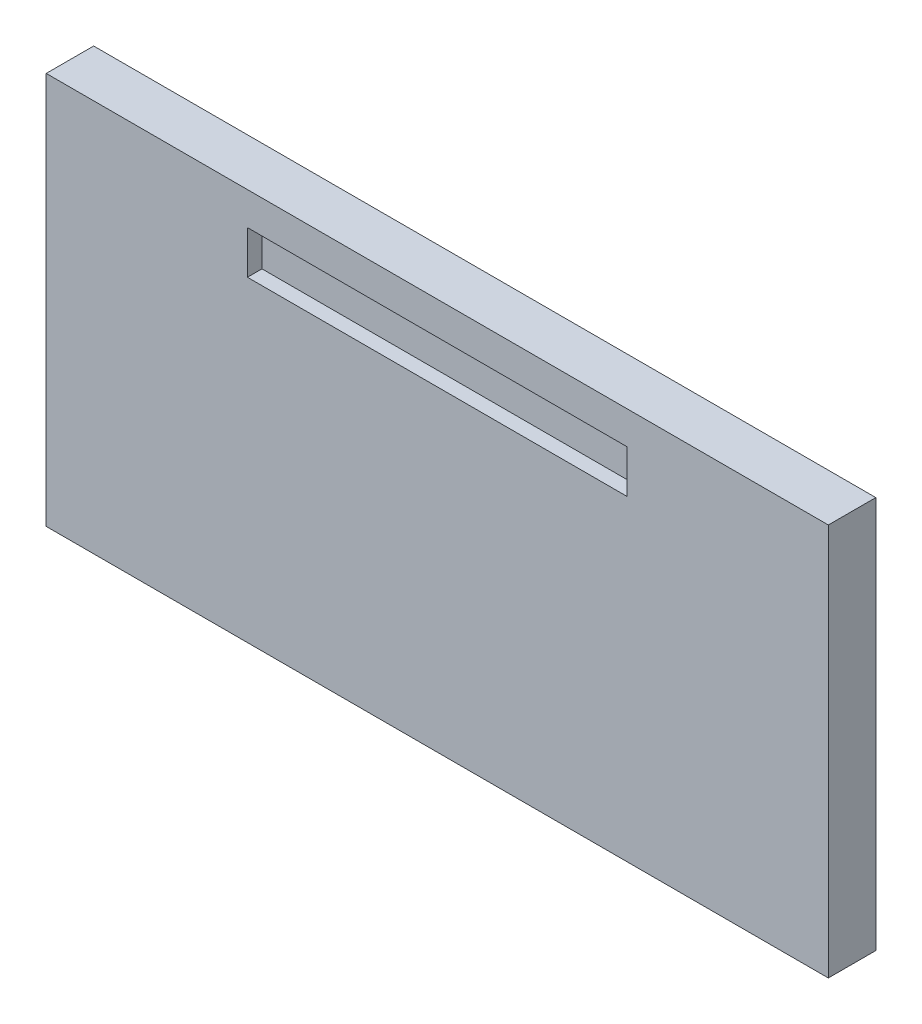
ISO-10303-21;
HEADER;
FILE_DESCRIPTION(('STEP AP214'),'2;1');
FILE_NAME('part.step','',(''),(''),'','','');
FILE_SCHEMA(('AUTOMOTIVE_DESIGN { 1 0 10303 214 1 1 1 1 }'));
ENDSEC;
DATA;
#1=APPLICATION_CONTEXT('core data for automotive mechanical design processes');
#2=APPLICATION_PROTOCOL_DEFINITION('international standard','automotive_design',2000,#1);
#3=PRODUCT_CONTEXT('',#1,'mechanical');
#4=PRODUCT('Part','Part','',(#3));
#5=PRODUCT_RELATED_PRODUCT_CATEGORY('part','',(#4));
#6=PRODUCT_DEFINITION_FORMATION('','',#4);
#7=PRODUCT_DEFINITION_CONTEXT('part definition',#1,'design');
#8=PRODUCT_DEFINITION('design','',#6,#7);
#9=PRODUCT_DEFINITION_SHAPE('','',#8);
#10=(LENGTH_UNIT() NAMED_UNIT(*) SI_UNIT(.MILLI.,.METRE.));
#11=(NAMED_UNIT(*) PLANE_ANGLE_UNIT() SI_UNIT($,.RADIAN.));
#12=(NAMED_UNIT(*) SI_UNIT($,.STERADIAN.) SOLID_ANGLE_UNIT());
#13=UNCERTAINTY_MEASURE_WITH_UNIT(LENGTH_MEASURE(1.E-05),#10,'distance_accuracy_value','');
#14=(GEOMETRIC_REPRESENTATION_CONTEXT(3) GLOBAL_UNCERTAINTY_ASSIGNED_CONTEXT((#13)) GLOBAL_UNIT_ASSIGNED_CONTEXT((#10,
#11,#12)) REPRESENTATION_CONTEXT('',''));
#15=CARTESIAN_POINT('',(0.,0.,0.));
#16=DIRECTION('',(0.,0.,1.));
#17=DIRECTION('',(1.,0.,0.));
#18=AXIS2_PLACEMENT_3D('',#15,#16,#17);
#19=CARTESIAN_POINT('',(0.,0.,38.5));
#20=DIRECTION('',(0.,0.,-1.));
#21=DIRECTION('',(-1.,0.,0.));
#22=AXIS2_PLACEMENT_3D('',#19,#20,#21);
#23=PLANE('',#22);
#24=DIRECTION('',(0.,-1.,0.));
#25=VECTOR('',#24,1.);
#26=CARTESIAN_POINT('',(0.,0.,38.5));
#27=LINE('',#26,#25);
#28=CARTESIAN_POINT('',(0.,310.,38.5));
#29=VERTEX_POINT('',#28);
#30=CARTESIAN_POINT('',(0.,0.,38.5));
#31=VERTEX_POINT('',#30);
#32=EDGE_CURVE('E145',#29,#31,#27,.T.);
#33=ORIENTED_EDGE('',*,*,#32,.T.);
#34=DIRECTION('',(1.,0.,0.));
#35=VECTOR('',#34,1.);
#36=CARTESIAN_POINT('',(0.,0.,38.5));
#37=LINE('',#36,#35);
#38=CARTESIAN_POINT('',(618.,0.,38.5));
#39=VERTEX_POINT('',#38);
#40=EDGE_CURVE('E92',#31,#39,#37,.T.);
#41=ORIENTED_EDGE('',*,*,#40,.T.);
#42=DIRECTION('',(0.,1.,0.));
#43=VECTOR('',#42,1.);
#44=CARTESIAN_POINT('',(618.,0.,38.5));
#45=LINE('',#44,#43);
#46=CARTESIAN_POINT('',(618.,310.,38.5));
#47=VERTEX_POINT('',#46);
#48=EDGE_CURVE('E148',#39,#47,#45,.T.);
#49=ORIENTED_EDGE('',*,*,#48,.T.);
#50=DIRECTION('',(-1.,0.,0.));
#51=VECTOR('',#50,1.);
#52=CARTESIAN_POINT('',(0.,310.,38.5));
#53=LINE('',#52,#51);
#54=EDGE_CURVE('E63',#47,#29,#53,.T.);
#55=ORIENTED_EDGE('',*,*,#54,.T.);
#56=EDGE_LOOP('',(#33,#41,#49,#55));
#57=FACE_BOUND('',#56,.T.);
#58=DIRECTION('',(0.,-1.,0.));
#59=VECTOR('',#58,1.);
#60=CARTESIAN_POINT('',(159.,0.,38.5));
#61=LINE('',#60,#59);
#62=CARTESIAN_POINT('',(159.,284.,38.5));
#63=VERTEX_POINT('',#62);
#64=CARTESIAN_POINT('',(159.,250.,38.5));
#65=VERTEX_POINT('',#64);
#66=EDGE_CURVE('E11',#63,#65,#61,.T.);
#67=ORIENTED_EDGE('',*,*,#66,.F.);
#68=DIRECTION('',(-1.,0.,0.));
#69=VECTOR('',#68,1.);
#70=CARTESIAN_POINT('',(0.,284.,38.5));
#71=LINE('',#70,#69);
#72=CARTESIAN_POINT('',(459.,284.,38.5));
#73=VERTEX_POINT('',#72);
#74=EDGE_CURVE('E167',#73,#63,#71,.T.);
#75=ORIENTED_EDGE('',*,*,#74,.F.);
#76=DIRECTION('',(0.,1.,0.));
#77=VECTOR('',#76,1.);
#78=CARTESIAN_POINT('',(459.,0.,38.5));
#79=LINE('',#78,#77);
#80=CARTESIAN_POINT('',(459.,250.,38.5));
#81=VERTEX_POINT('',#80);
#82=EDGE_CURVE('E169',#81,#73,#79,.T.);
#83=ORIENTED_EDGE('',*,*,#82,.F.);
#84=DIRECTION('',(1.,0.,0.));
#85=VECTOR('',#84,1.);
#86=CARTESIAN_POINT('',(0.,250.,38.5));
#87=LINE('',#86,#85);
#88=EDGE_CURVE('E47',#65,#81,#87,.T.);
#89=ORIENTED_EDGE('',*,*,#88,.F.);
#90=EDGE_LOOP('',(#67,#75,#83,#89));
#91=FACE_BOUND('',#90,.T.);
#92=ADVANCED_FACE('F39',(#57,#91),#23,.F.);
#93=CARTESIAN_POINT('',(0.,0.,38.5));
#94=DIRECTION('',(1.,0.,0.));
#95=DIRECTION('',(0.,0.,-1.));
#96=AXIS2_PLACEMENT_3D('',#93,#94,#95);
#97=PLANE('',#96);
#98=DIRECTION('',(0.,-1.,0.));
#99=VECTOR('',#98,1.);
#100=CARTESIAN_POINT('',(0.,0.,1.));
#101=LINE('',#100,#99);
#102=CARTESIAN_POINT('',(0.,310.,1.));
#103=VERTEX_POINT('',#102);
#104=CARTESIAN_POINT('',(0.,0.,1.));
#105=VERTEX_POINT('',#104);
#106=EDGE_CURVE('E122',#103,#105,#101,.T.);
#107=ORIENTED_EDGE('',*,*,#106,.T.);
#108=DIRECTION('',(0.,0.,-1.));
#109=VECTOR('',#108,1.);
#110=CARTESIAN_POINT('',(0.,0.,38.5));
#111=LINE('',#110,#109);
#112=EDGE_CURVE('E165',#31,#105,#111,.T.);
#113=ORIENTED_EDGE('',*,*,#112,.F.);
#114=ORIENTED_EDGE('',*,*,#32,.F.);
#115=DIRECTION('',(0.,0.,-1.));
#116=VECTOR('',#115,1.);
#117=CARTESIAN_POINT('',(0.,310.,38.5));
#118=LINE('',#117,#116);
#119=EDGE_CURVE('E151',#29,#103,#118,.T.);
#120=ORIENTED_EDGE('',*,*,#119,.T.);
#121=EDGE_LOOP('',(#107,#113,#114,#120));
#122=FACE_BOUND('',#121,.T.);
#123=ADVANCED_FACE('F41',(#122),#97,.F.);
#124=CARTESIAN_POINT('',(0.,0.,38.5));
#125=DIRECTION('',(0.,1.,0.));
#126=DIRECTION('',(0.,0.,1.));
#127=AXIS2_PLACEMENT_3D('',#124,#125,#126);
#128=PLANE('',#127);
#129=DIRECTION('',(1.,0.,0.));
#130=VECTOR('',#129,1.);
#131=CARTESIAN_POINT('',(0.,0.,1.));
#132=LINE('',#131,#130);
#133=CARTESIAN_POINT('',(618.,0.,1.));
#134=VERTEX_POINT('',#133);
#135=EDGE_CURVE('E154',#105,#134,#132,.T.);
#136=ORIENTED_EDGE('',*,*,#135,.T.);
#137=DIRECTION('',(0.,0.,-1.));
#138=VECTOR('',#137,1.);
#139=CARTESIAN_POINT('',(618.,0.,38.5));
#140=LINE('',#139,#138);
#141=EDGE_CURVE('E162',#39,#134,#140,.T.);
#142=ORIENTED_EDGE('',*,*,#141,.F.);
#143=ORIENTED_EDGE('',*,*,#40,.F.);
#144=ORIENTED_EDGE('',*,*,#112,.T.);
#145=EDGE_LOOP('',(#136,#142,#143,#144));
#146=FACE_BOUND('',#145,.T.);
#147=ADVANCED_FACE('F191',(#146),#128,.F.);
#148=CARTESIAN_POINT('',(618.,0.,38.5));
#149=DIRECTION('',(-1.,0.,0.));
#150=DIRECTION('',(0.,0.,1.));
#151=AXIS2_PLACEMENT_3D('',#148,#149,#150);
#152=PLANE('',#151);
#153=DIRECTION('',(0.,1.,0.));
#154=VECTOR('',#153,1.);
#155=CARTESIAN_POINT('',(618.,0.,1.));
#156=LINE('',#155,#154);
#157=CARTESIAN_POINT('',(618.,310.,1.));
#158=VERTEX_POINT('',#157);
#159=EDGE_CURVE('E156',#134,#158,#156,.T.);
#160=ORIENTED_EDGE('',*,*,#159,.T.);
#161=DIRECTION('',(0.,0.,-1.));
#162=VECTOR('',#161,1.);
#163=CARTESIAN_POINT('',(618.,310.,38.5));
#164=LINE('',#163,#162);
#165=EDGE_CURVE('E160',#47,#158,#164,.T.);
#166=ORIENTED_EDGE('',*,*,#165,.F.);
#167=ORIENTED_EDGE('',*,*,#48,.F.);
#168=ORIENTED_EDGE('',*,*,#141,.T.);
#169=EDGE_LOOP('',(#160,#166,#167,#168));
#170=FACE_BOUND('',#169,.T.);
#171=ADVANCED_FACE('F202',(#170),#152,.F.);
#172=CARTESIAN_POINT('',(0.,310.,38.5));
#173=DIRECTION('',(0.,-1.,0.));
#174=DIRECTION('',(0.,0.,-1.));
#175=AXIS2_PLACEMENT_3D('',#172,#173,#174);
#176=PLANE('',#175);
#177=DIRECTION('',(-1.,0.,0.));
#178=VECTOR('',#177,1.);
#179=CARTESIAN_POINT('',(0.,310.,1.));
#180=LINE('',#179,#178);
#181=EDGE_CURVE('E84',#158,#103,#180,.T.);
#182=ORIENTED_EDGE('',*,*,#181,.T.);
#183=ORIENTED_EDGE('',*,*,#119,.F.);
#184=ORIENTED_EDGE('',*,*,#54,.F.);
#185=ORIENTED_EDGE('',*,*,#165,.T.);
#186=EDGE_LOOP('',(#182,#183,#184,#185));
#187=FACE_BOUND('',#186,.T.);
#188=ADVANCED_FACE('F198',(#187),#176,.F.);
#189=CARTESIAN_POINT('',(0.,0.,1.));
#190=DIRECTION('',(0.,0.,-1.));
#191=DIRECTION('',(-1.,0.,0.));
#192=AXIS2_PLACEMENT_3D('',#189,#190,#191);
#193=PLANE('',#192);
#194=ORIENTED_EDGE('',*,*,#106,.F.);
#195=ORIENTED_EDGE('',*,*,#181,.F.);
#196=ORIENTED_EDGE('',*,*,#159,.F.);
#197=ORIENTED_EDGE('',*,*,#135,.F.);
#198=EDGE_LOOP('',(#194,#195,#196,#197));
#199=FACE_BOUND('',#198,.T.);
#200=ADVANCED_FACE('F196',(#199),#193,.T.);
#201=CARTESIAN_POINT('',(159.,250.,41.));
#202=DIRECTION('',(1.,0.,0.));
#203=DIRECTION('',(0.,0.,-1.));
#204=AXIS2_PLACEMENT_3D('',#201,#202,#203);
#205=PLANE('',#204);
#206=ORIENTED_EDGE('',*,*,#66,.T.);
#207=DIRECTION('',(0.,0.,-1.));
#208=VECTOR('',#207,1.);
#209=CARTESIAN_POINT('',(159.,250.,41.));
#210=LINE('',#209,#208);
#211=CARTESIAN_POINT('',(159.,250.,27.));
#212=VERTEX_POINT('',#211);
#213=EDGE_CURVE('E113',#65,#212,#210,.T.);
#214=ORIENTED_EDGE('',*,*,#213,.T.);
#215=DIRECTION('',(0.,-1.,0.));
#216=VECTOR('',#215,1.);
#217=CARTESIAN_POINT('',(159.,250.,27.));
#218=LINE('',#217,#216);
#219=CARTESIAN_POINT('',(159.,284.,27.));
#220=VERTEX_POINT('',#219);
#221=EDGE_CURVE('E118',#220,#212,#218,.T.);
#222=ORIENTED_EDGE('',*,*,#221,.F.);
#223=DIRECTION('',(0.,0.,-1.));
#224=VECTOR('',#223,1.);
#225=CARTESIAN_POINT('',(159.,284.,41.));
#226=LINE('',#225,#224);
#227=EDGE_CURVE('E141',#63,#220,#226,.T.);
#228=ORIENTED_EDGE('',*,*,#227,.F.);
#229=EDGE_LOOP('',(#206,#214,#222,#228));
#230=FACE_BOUND('',#229,.T.);
#231=ADVANCED_FACE('F115',(#230),#205,.T.);
#232=CARTESIAN_POINT('',(159.,250.,41.));
#233=DIRECTION('',(0.,1.,0.));
#234=DIRECTION('',(0.,0.,1.));
#235=AXIS2_PLACEMENT_3D('',#232,#233,#234);
#236=PLANE('',#235);
#237=ORIENTED_EDGE('',*,*,#88,.T.);
#238=DIRECTION('',(0.,0.,-1.));
#239=VECTOR('',#238,1.);
#240=CARTESIAN_POINT('',(459.,250.,41.));
#241=LINE('',#240,#239);
#242=CARTESIAN_POINT('',(459.,250.,27.));
#243=VERTEX_POINT('',#242);
#244=EDGE_CURVE('E123',#81,#243,#241,.T.);
#245=ORIENTED_EDGE('',*,*,#244,.T.);
#246=DIRECTION('',(1.,0.,0.));
#247=VECTOR('',#246,1.);
#248=CARTESIAN_POINT('',(159.,250.,27.));
#249=LINE('',#248,#247);
#250=EDGE_CURVE('E126',#212,#243,#249,.T.);
#251=ORIENTED_EDGE('',*,*,#250,.F.);
#252=ORIENTED_EDGE('',*,*,#213,.F.);
#253=EDGE_LOOP('',(#237,#245,#251,#252));
#254=FACE_BOUND('',#253,.T.);
#255=ADVANCED_FACE('F127',(#254),#236,.T.);
#256=CARTESIAN_POINT('',(459.,250.,41.));
#257=DIRECTION('',(-1.,0.,0.));
#258=DIRECTION('',(0.,0.,1.));
#259=AXIS2_PLACEMENT_3D('',#256,#257,#258);
#260=PLANE('',#259);
#261=ORIENTED_EDGE('',*,*,#82,.T.);
#262=DIRECTION('',(0.,0.,-1.));
#263=VECTOR('',#262,1.);
#264=CARTESIAN_POINT('',(459.,284.,41.));
#265=LINE('',#264,#263);
#266=CARTESIAN_POINT('',(459.,284.,27.));
#267=VERTEX_POINT('',#266);
#268=EDGE_CURVE('E54',#73,#267,#265,.T.);
#269=ORIENTED_EDGE('',*,*,#268,.T.);
#270=DIRECTION('',(0.,1.,0.));
#271=VECTOR('',#270,1.);
#272=CARTESIAN_POINT('',(459.,250.,27.));
#273=LINE('',#272,#271);
#274=EDGE_CURVE('E132',#243,#267,#273,.T.);
#275=ORIENTED_EDGE('',*,*,#274,.F.);
#276=ORIENTED_EDGE('',*,*,#244,.F.);
#277=EDGE_LOOP('',(#261,#269,#275,#276));
#278=FACE_BOUND('',#277,.T.);
#279=ADVANCED_FACE('F173',(#278),#260,.T.);
#280=CARTESIAN_POINT('',(159.,284.,41.));
#281=DIRECTION('',(0.,-1.,0.));
#282=DIRECTION('',(0.,0.,-1.));
#283=AXIS2_PLACEMENT_3D('',#280,#281,#282);
#284=PLANE('',#283);
#285=ORIENTED_EDGE('',*,*,#74,.T.);
#286=ORIENTED_EDGE('',*,*,#227,.T.);
#287=DIRECTION('',(-1.,0.,0.));
#288=VECTOR('',#287,1.);
#289=CARTESIAN_POINT('',(159.,284.,27.));
#290=LINE('',#289,#288);
#291=EDGE_CURVE('E136',#267,#220,#290,.T.);
#292=ORIENTED_EDGE('',*,*,#291,.F.);
#293=ORIENTED_EDGE('',*,*,#268,.F.);
#294=EDGE_LOOP('',(#285,#286,#292,#293));
#295=FACE_BOUND('',#294,.T.);
#296=ADVANCED_FACE('F175',(#295),#284,.T.);
#297=CARTESIAN_POINT('',(0.,0.,27.));
#298=DIRECTION('',(0.,0.,-1.));
#299=DIRECTION('',(-1.,0.,0.));
#300=AXIS2_PLACEMENT_3D('',#297,#298,#299);
#301=PLANE('',#300);
#302=ORIENTED_EDGE('',*,*,#221,.T.);
#303=ORIENTED_EDGE('',*,*,#250,.T.);
#304=ORIENTED_EDGE('',*,*,#274,.T.);
#305=ORIENTED_EDGE('',*,*,#291,.T.);
#306=EDGE_LOOP('',(#302,#303,#304,#305));
#307=FACE_BOUND('',#306,.T.);
#308=ADVANCED_FACE('F135',(#307),#301,.F.);
#309=CLOSED_SHELL('',(#92,#123,#147,#171,#188,#200,#231,#255,#279,#296,#308));
#310=MANIFOLD_SOLID_BREP('B2',#309);
#311=ADVANCED_BREP_SHAPE_REPRESENTATION('',(#18,#310),#14);
#312=SHAPE_DEFINITION_REPRESENTATION(#9,#311);
ENDSEC;
END-ISO-10303-21;
